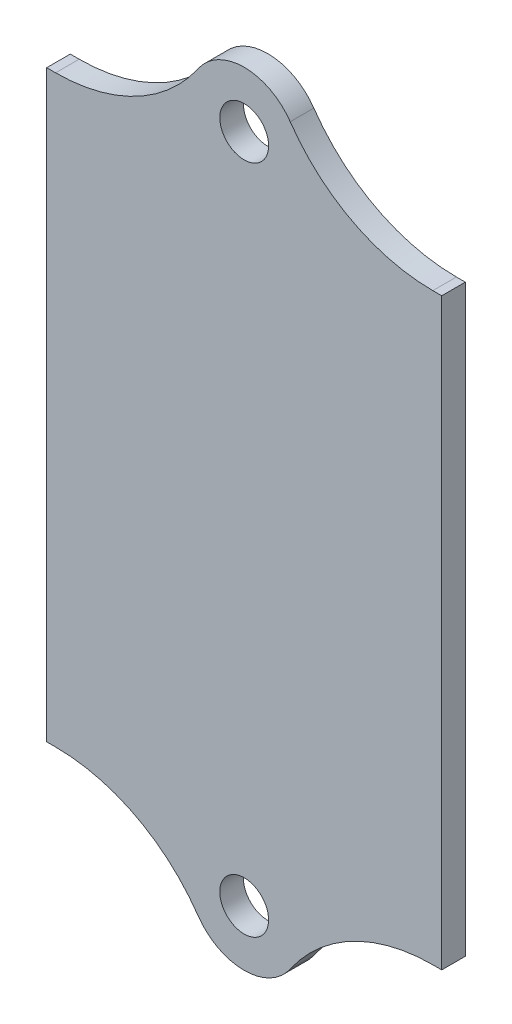
ISO-10303-21;
HEADER;
FILE_DESCRIPTION(('STEP AP214'),'2;1');
FILE_NAME('part.step','',(''),(''),'','','');
FILE_SCHEMA(('AUTOMOTIVE_DESIGN { 1 0 10303 214 1 1 1 1 }'));
ENDSEC;
DATA;
#1=APPLICATION_CONTEXT('core data for automotive mechanical design processes');
#2=APPLICATION_PROTOCOL_DEFINITION('international standard','automotive_design',2000,#1);
#3=PRODUCT_CONTEXT('',#1,'mechanical');
#4=PRODUCT('Part','Part','',(#3));
#5=PRODUCT_RELATED_PRODUCT_CATEGORY('part','',(#4));
#6=PRODUCT_DEFINITION_FORMATION('','',#4);
#7=PRODUCT_DEFINITION_CONTEXT('part definition',#1,'design');
#8=PRODUCT_DEFINITION('design','',#6,#7);
#9=PRODUCT_DEFINITION_SHAPE('','',#8);
#10=(LENGTH_UNIT() NAMED_UNIT(*) SI_UNIT(.MILLI.,.METRE.));
#11=(NAMED_UNIT(*) PLANE_ANGLE_UNIT() SI_UNIT($,.RADIAN.));
#12=(NAMED_UNIT(*) SI_UNIT($,.STERADIAN.) SOLID_ANGLE_UNIT());
#13=UNCERTAINTY_MEASURE_WITH_UNIT(LENGTH_MEASURE(1.E-05),#10,'distance_accuracy_value','');
#14=(GEOMETRIC_REPRESENTATION_CONTEXT(3) GLOBAL_UNCERTAINTY_ASSIGNED_CONTEXT((#13)) GLOBAL_UNIT_ASSIGNED_CONTEXT((#10,
#11,#12)) REPRESENTATION_CONTEXT('',''));
#15=CARTESIAN_POINT('',(0.,0.,0.));
#16=DIRECTION('',(0.,0.,1.));
#17=DIRECTION('',(1.,0.,0.));
#18=AXIS2_PLACEMENT_3D('',#15,#16,#17);
#19=CARTESIAN_POINT('',(-10.3513215814542,8.,1.5));
#20=DIRECTION('',(0.,1.,0.));
#21=DIRECTION('',(0.,0.,1.));
#22=AXIS2_PLACEMENT_3D('',#19,#20,#21);
#23=PLANE('',#22);
#24=DIRECTION('',(1.,0.,0.));
#25=VECTOR('',#24,1.);
#26=CARTESIAN_POINT('',(-10.3513215814542,8.,0.));
#27=LINE('',#26,#25);
#28=CARTESIAN_POINT('',(-10.3513215814542,8.,0.));
#29=VERTEX_POINT('',#28);
#30=CARTESIAN_POINT('',(-9.78631219471708,8.,0.));
#31=VERTEX_POINT('',#30);
#32=EDGE_CURVE('E155',#29,#31,#27,.T.);
#33=ORIENTED_EDGE('',*,*,#32,.T.);
#34=DIRECTION('',(0.,0.,-1.));
#35=VECTOR('',#34,1.);
#36=CARTESIAN_POINT('',(-9.78631219471708,8.,1.5));
#37=LINE('',#36,#35);
#38=CARTESIAN_POINT('',(-9.78631219471708,8.,1.5));
#39=VERTEX_POINT('',#38);
#40=EDGE_CURVE('E11',#39,#31,#37,.T.);
#41=ORIENTED_EDGE('',*,*,#40,.F.);
#42=DIRECTION('',(1.,0.,0.));
#43=VECTOR('',#42,1.);
#44=CARTESIAN_POINT('',(-10.3513215814542,8.,1.5));
#45=LINE('',#44,#43);
#46=CARTESIAN_POINT('',(-10.3513215814542,8.,1.5));
#47=VERTEX_POINT('',#46);
#48=EDGE_CURVE('E179',#47,#39,#45,.T.);
#49=ORIENTED_EDGE('',*,*,#48,.F.);
#50=DIRECTION('',(0.,0.,-1.));
#51=VECTOR('',#50,1.);
#52=CARTESIAN_POINT('',(-10.3513215814542,8.,1.5));
#53=LINE('',#52,#51);
#54=EDGE_CURVE('E151',#47,#29,#53,.T.);
#55=ORIENTED_EDGE('',*,*,#54,.T.);
#56=EDGE_LOOP('',(#33,#41,#49,#55));
#57=FACE_BOUND('',#56,.T.);
#58=ADVANCED_FACE('F35',(#57),#23,.F.);
#59=CARTESIAN_POINT('',(-9.78631219471708,-3.,1.5));
#60=DIRECTION('',(0.,0.,-1.));
#61=DIRECTION('',(-1.,0.,0.));
#62=AXIS2_PLACEMENT_3D('',#59,#60,#61);
#63=CYLINDRICAL_SURFACE('',#62,11.);
#64=CARTESIAN_POINT('',(-9.78631219471708,-3.,0.));
#65=DIRECTION('',(0.,0.,-1.));
#66=DIRECTION('',(1.,0.,0.));
#67=AXIS2_PLACEMENT_3D('',#64,#65,#66);
#68=CIRCLE('',#67,11.);
#69=CARTESIAN_POINT('',(-0.725494548951314,3.23711340206186,0.));
#70=VERTEX_POINT('',#69);
#71=EDGE_CURVE('E158',#31,#70,#68,.T.);
#72=ORIENTED_EDGE('',*,*,#71,.T.);
#73=DIRECTION('',(0.,0.,-1.));
#74=VECTOR('',#73,1.);
#75=CARTESIAN_POINT('',(-0.725494548951314,3.23711340206186,1.5));
#76=LINE('',#75,#74);
#77=CARTESIAN_POINT('',(-0.725494548951314,3.23711340206186,1.5));
#78=VERTEX_POINT('',#77);
#79=EDGE_CURVE('E43',#78,#70,#76,.T.);
#80=ORIENTED_EDGE('',*,*,#79,.F.);
#81=CARTESIAN_POINT('',(-9.78631219471708,-3.,1.5));
#82=DIRECTION('',(0.,0.,-1.));
#83=DIRECTION('',(1.,0.,0.));
#84=AXIS2_PLACEMENT_3D('',#81,#82,#83);
#85=CIRCLE('',#84,11.);
#86=EDGE_CURVE('E105',#39,#78,#85,.T.);
#87=ORIENTED_EDGE('',*,*,#86,.F.);
#88=ORIENTED_EDGE('',*,*,#40,.T.);
#89=EDGE_LOOP('',(#72,#80,#87,#88));
#90=FACE_BOUND('',#89,.T.);
#91=ADVANCED_FACE('F258',(#90),#63,.F.);
#92=CARTESIAN_POINT('',(2.19867841854582,5.25,1.5));
#93=DIRECTION('',(0.,0.,-1.));
#94=DIRECTION('',(-1.,0.,0.));
#95=AXIS2_PLACEMENT_3D('',#92,#93,#94);
#96=CYLINDRICAL_SURFACE('',#95,3.55);
#97=CARTESIAN_POINT('',(2.19867841854582,5.25,0.));
#98=DIRECTION('',(0.,0.,1.));
#99=DIRECTION('',(1.,0.,0.));
#100=AXIS2_PLACEMENT_3D('',#97,#98,#99);
#101=CIRCLE('',#100,3.55);
#102=CARTESIAN_POINT('',(5.12285138604296,3.23711340206186,0.));
#103=VERTEX_POINT('',#102);
#104=EDGE_CURVE('E161',#70,#103,#101,.T.);
#105=ORIENTED_EDGE('',*,*,#104,.T.);
#106=DIRECTION('',(0.,0.,-1.));
#107=VECTOR('',#106,1.);
#108=CARTESIAN_POINT('',(5.12285138604296,3.23711340206186,1.5));
#109=LINE('',#108,#107);
#110=CARTESIAN_POINT('',(5.12285138604296,3.23711340206186,1.5));
#111=VERTEX_POINT('',#110);
#112=EDGE_CURVE('E198',#111,#103,#109,.T.);
#113=ORIENTED_EDGE('',*,*,#112,.F.);
#114=CARTESIAN_POINT('',(2.19867841854582,5.25,1.5));
#115=DIRECTION('',(0.,0.,1.));
#116=DIRECTION('',(1.,0.,0.));
#117=AXIS2_PLACEMENT_3D('',#114,#115,#116);
#118=CIRCLE('',#117,3.55);
#119=EDGE_CURVE('E206',#78,#111,#118,.T.);
#120=ORIENTED_EDGE('',*,*,#119,.F.);
#121=ORIENTED_EDGE('',*,*,#79,.T.);
#122=EDGE_LOOP('',(#105,#113,#120,#121));
#123=FACE_BOUND('',#122,.T.);
#124=ADVANCED_FACE('F204',(#123),#96,.T.);
#125=CARTESIAN_POINT('',(14.1836690318087,-3.,1.5));
#126=DIRECTION('',(0.,0.,-1.));
#127=DIRECTION('',(-1.,0.,0.));
#128=AXIS2_PLACEMENT_3D('',#125,#126,#127);
#129=CYLINDRICAL_SURFACE('',#128,11.);
#130=CARTESIAN_POINT('',(14.1836690318087,-3.,0.));
#131=DIRECTION('',(0.,0.,-1.));
#132=DIRECTION('',(1.,0.,0.));
#133=AXIS2_PLACEMENT_3D('',#130,#131,#132);
#134=CIRCLE('',#133,11.);
#135=CARTESIAN_POINT('',(14.1836690318087,8.,0.));
#136=VERTEX_POINT('',#135);
#137=EDGE_CURVE('E163',#103,#136,#134,.T.);
#138=ORIENTED_EDGE('',*,*,#137,.T.);
#139=DIRECTION('',(0.,0.,-1.));
#140=VECTOR('',#139,1.);
#141=CARTESIAN_POINT('',(14.1836690318087,8.,1.5));
#142=LINE('',#141,#140);
#143=CARTESIAN_POINT('',(14.1836690318087,8.,1.5));
#144=VERTEX_POINT('',#143);
#145=EDGE_CURVE('E195',#144,#136,#142,.T.);
#146=ORIENTED_EDGE('',*,*,#145,.F.);
#147=CARTESIAN_POINT('',(14.1836690318087,-3.,1.5));
#148=DIRECTION('',(0.,0.,-1.));
#149=DIRECTION('',(1.,0.,0.));
#150=AXIS2_PLACEMENT_3D('',#147,#148,#149);
#151=CIRCLE('',#150,11.);
#152=EDGE_CURVE('E224',#111,#144,#151,.T.);
#153=ORIENTED_EDGE('',*,*,#152,.F.);
#154=ORIENTED_EDGE('',*,*,#112,.T.);
#155=EDGE_LOOP('',(#138,#146,#153,#154));
#156=FACE_BOUND('',#155,.T.);
#157=ADVANCED_FACE('F215',(#156),#129,.F.);
#158=CARTESIAN_POINT('',(14.1836690318087,8.,1.5));
#159=DIRECTION('',(0.,1.,0.));
#160=DIRECTION('',(-1.,0.,0.));
#161=AXIS2_PLACEMENT_3D('',#158,#159,#160);
#162=PLANE('',#161);
#163=DIRECTION('',(1.,0.,0.));
#164=VECTOR('',#163,1.);
#165=CARTESIAN_POINT('',(14.1836690318087,8.,0.));
#166=LINE('',#165,#164);
#167=CARTESIAN_POINT('',(14.7486784185458,8.,0.));
#168=VERTEX_POINT('',#167);
#169=EDGE_CURVE('E165',#136,#168,#166,.T.);
#170=ORIENTED_EDGE('',*,*,#169,.T.);
#171=DIRECTION('',(0.,0.,-1.));
#172=VECTOR('',#171,1.);
#173=CARTESIAN_POINT('',(14.7486784185458,8.,1.5));
#174=LINE('',#173,#172);
#175=CARTESIAN_POINT('',(14.7486784185458,8.,1.5));
#176=VERTEX_POINT('',#175);
#177=EDGE_CURVE('E192',#176,#168,#174,.T.);
#178=ORIENTED_EDGE('',*,*,#177,.F.);
#179=DIRECTION('',(1.,0.,0.));
#180=VECTOR('',#179,1.);
#181=CARTESIAN_POINT('',(14.1836690318087,8.,1.5));
#182=LINE('',#181,#180);
#183=EDGE_CURVE('E221',#144,#176,#182,.T.);
#184=ORIENTED_EDGE('',*,*,#183,.F.);
#185=ORIENTED_EDGE('',*,*,#145,.T.);
#186=EDGE_LOOP('',(#170,#178,#184,#185));
#187=FACE_BOUND('',#186,.T.);
#188=ADVANCED_FACE('F219',(#187),#162,.F.);
#189=CARTESIAN_POINT('',(14.7486784185458,8.,1.5));
#190=DIRECTION('',(-1.,0.,0.));
#191=DIRECTION('',(0.,-1.,0.));
#192=AXIS2_PLACEMENT_3D('',#189,#190,#191);
#193=PLANE('',#192);
#194=DIRECTION('',(0.,1.,0.));
#195=VECTOR('',#194,1.);
#196=CARTESIAN_POINT('',(14.7486784185458,8.,0.));
#197=LINE('',#196,#195);
#198=CARTESIAN_POINT('',(14.7486784185458,45.1,0.));
#199=VERTEX_POINT('',#198);
#200=EDGE_CURVE('E167',#168,#199,#197,.T.);
#201=ORIENTED_EDGE('',*,*,#200,.T.);
#202=DIRECTION('',(0.,0.,-1.));
#203=VECTOR('',#202,1.);
#204=CARTESIAN_POINT('',(14.7486784185458,45.1,1.5));
#205=LINE('',#204,#203);
#206=CARTESIAN_POINT('',(14.7486784185458,45.1,1.5));
#207=VERTEX_POINT('',#206);
#208=EDGE_CURVE('E189',#207,#199,#205,.T.);
#209=ORIENTED_EDGE('',*,*,#208,.F.);
#210=DIRECTION('',(0.,1.,0.));
#211=VECTOR('',#210,1.);
#212=CARTESIAN_POINT('',(14.7486784185458,8.,1.5));
#213=LINE('',#212,#211);
#214=EDGE_CURVE('E223',#176,#207,#213,.T.);
#215=ORIENTED_EDGE('',*,*,#214,.F.);
#216=ORIENTED_EDGE('',*,*,#177,.T.);
#217=EDGE_LOOP('',(#201,#209,#215,#216));
#218=FACE_BOUND('',#217,.T.);
#219=ADVANCED_FACE('F271',(#218),#193,.F.);
#220=CARTESIAN_POINT('',(14.3230340715279,45.1,1.5));
#221=DIRECTION('',(0.,-1.,0.));
#222=DIRECTION('',(0.,0.,-1.));
#223=AXIS2_PLACEMENT_3D('',#220,#221,#222);
#224=PLANE('',#223);
#225=DIRECTION('',(-1.,0.,0.));
#226=VECTOR('',#225,1.);
#227=CARTESIAN_POINT('',(14.3230340715279,45.1,0.));
#228=LINE('',#227,#226);
#229=CARTESIAN_POINT('',(14.1836690318087,45.1,0.));
#230=VERTEX_POINT('',#229);
#231=EDGE_CURVE('E170',#199,#230,#228,.T.);
#232=ORIENTED_EDGE('',*,*,#231,.T.);
#233=DIRECTION('',(0.,0.,-1.));
#234=VECTOR('',#233,1.);
#235=CARTESIAN_POINT('',(14.1836690318087,45.1,1.5));
#236=LINE('',#235,#234);
#237=CARTESIAN_POINT('',(14.1836690318087,45.1,1.5));
#238=VERTEX_POINT('',#237);
#239=EDGE_CURVE('E186',#238,#230,#236,.T.);
#240=ORIENTED_EDGE('',*,*,#239,.F.);
#241=DIRECTION('',(-1.,0.,0.));
#242=VECTOR('',#241,1.);
#243=CARTESIAN_POINT('',(14.7486784185458,45.1,1.5));
#244=LINE('',#243,#242);
#245=EDGE_CURVE('E226',#207,#238,#244,.T.);
#246=ORIENTED_EDGE('',*,*,#245,.F.);
#247=ORIENTED_EDGE('',*,*,#208,.T.);
#248=EDGE_LOOP('',(#232,#240,#246,#247));
#249=FACE_BOUND('',#248,.T.);
#250=ADVANCED_FACE('F274',(#249),#224,.F.);
#251=CARTESIAN_POINT('',(14.1836690318087,56.1,1.5));
#252=DIRECTION('',(0.,0.,-1.));
#253=DIRECTION('',(-1.,0.,0.));
#254=AXIS2_PLACEMENT_3D('',#251,#252,#253);
#255=CYLINDRICAL_SURFACE('',#254,11.);
#256=CARTESIAN_POINT('',(14.1836690318087,56.1,0.));
#257=DIRECTION('',(0.,0.,-1.));
#258=DIRECTION('',(1.,0.,0.));
#259=AXIS2_PLACEMENT_3D('',#256,#257,#258);
#260=CIRCLE('',#259,11.);
#261=CARTESIAN_POINT('',(5.12285138604295,49.8628865979382,0.));
#262=VERTEX_POINT('',#261);
#263=EDGE_CURVE('E172',#230,#262,#260,.T.);
#264=ORIENTED_EDGE('',*,*,#263,.T.);
#265=DIRECTION('',(0.,0.,-1.));
#266=VECTOR('',#265,1.);
#267=CARTESIAN_POINT('',(5.12285138604295,49.8628865979382,1.5));
#268=LINE('',#267,#266);
#269=CARTESIAN_POINT('',(5.12285138604295,49.8628865979382,1.5));
#270=VERTEX_POINT('',#269);
#271=EDGE_CURVE('E183',#270,#262,#268,.T.);
#272=ORIENTED_EDGE('',*,*,#271,.F.);
#273=CARTESIAN_POINT('',(14.1836690318087,56.1,1.5));
#274=DIRECTION('',(0.,0.,-1.));
#275=DIRECTION('',(1.,0.,0.));
#276=AXIS2_PLACEMENT_3D('',#273,#274,#275);
#277=CIRCLE('',#276,11.);
#278=EDGE_CURVE('E232',#238,#270,#277,.T.);
#279=ORIENTED_EDGE('',*,*,#278,.F.);
#280=ORIENTED_EDGE('',*,*,#239,.T.);
#281=EDGE_LOOP('',(#264,#272,#279,#280));
#282=FACE_BOUND('',#281,.T.);
#283=ADVANCED_FACE('F238',(#282),#255,.F.);
#284=CARTESIAN_POINT('',(2.19867841854582,47.85,1.5));
#285=DIRECTION('',(0.,0.,-1.));
#286=DIRECTION('',(-1.,0.,0.));
#287=AXIS2_PLACEMENT_3D('',#284,#285,#286);
#288=CYLINDRICAL_SURFACE('',#287,3.55);
#289=CARTESIAN_POINT('',(2.19867841854582,47.85,0.));
#290=DIRECTION('',(0.,0.,1.));
#291=DIRECTION('',(1.,0.,0.));
#292=AXIS2_PLACEMENT_3D('',#289,#290,#291);
#293=CIRCLE('',#292,3.55);
#294=CARTESIAN_POINT('',(-0.725494548951327,49.8628865979381,0.));
#295=VERTEX_POINT('',#294);
#296=EDGE_CURVE('E174',#262,#295,#293,.T.);
#297=ORIENTED_EDGE('',*,*,#296,.T.);
#298=DIRECTION('',(0.,0.,-1.));
#299=VECTOR('',#298,1.);
#300=CARTESIAN_POINT('',(-0.725494548951327,49.8628865979381,1.5));
#301=LINE('',#300,#299);
#302=CARTESIAN_POINT('',(-0.725494548951327,49.8628865979381,1.5));
#303=VERTEX_POINT('',#302);
#304=EDGE_CURVE('E146',#303,#295,#301,.T.);
#305=ORIENTED_EDGE('',*,*,#304,.F.);
#306=CARTESIAN_POINT('',(2.19867841854582,47.85,1.5));
#307=DIRECTION('',(0.,0.,1.));
#308=DIRECTION('',(1.,0.,0.));
#309=AXIS2_PLACEMENT_3D('',#306,#307,#308);
#310=CIRCLE('',#309,3.55);
#311=EDGE_CURVE('E136',#270,#303,#310,.T.);
#312=ORIENTED_EDGE('',*,*,#311,.F.);
#313=ORIENTED_EDGE('',*,*,#271,.T.);
#314=EDGE_LOOP('',(#297,#305,#312,#313));
#315=FACE_BOUND('',#314,.T.);
#316=ADVANCED_FACE('F242',(#315),#288,.T.);
#317=CARTESIAN_POINT('',(-9.78631219471709,56.1,1.5));
#318=DIRECTION('',(0.,0.,-1.));
#319=DIRECTION('',(-1.,0.,0.));
#320=AXIS2_PLACEMENT_3D('',#317,#318,#319);
#321=CYLINDRICAL_SURFACE('',#320,11.);
#322=CARTESIAN_POINT('',(-9.78631219471709,56.1,0.));
#323=DIRECTION('',(0.,0.,-1.));
#324=DIRECTION('',(1.,0.,0.));
#325=AXIS2_PLACEMENT_3D('',#322,#323,#324);
#326=CIRCLE('',#325,11.);
#327=CARTESIAN_POINT('',(-9.78631219471709,45.1,0.));
#328=VERTEX_POINT('',#327);
#329=EDGE_CURVE('E145',#295,#328,#326,.T.);
#330=ORIENTED_EDGE('',*,*,#329,.T.);
#331=DIRECTION('',(0.,0.,-1.));
#332=VECTOR('',#331,1.);
#333=CARTESIAN_POINT('',(-9.78631219471709,45.1,1.5));
#334=LINE('',#333,#332);
#335=CARTESIAN_POINT('',(-9.78631219471709,45.1,1.5));
#336=VERTEX_POINT('',#335);
#337=EDGE_CURVE('E142',#336,#328,#334,.T.);
#338=ORIENTED_EDGE('',*,*,#337,.F.);
#339=CARTESIAN_POINT('',(-9.78631219471709,56.1,1.5));
#340=DIRECTION('',(0.,0.,-1.));
#341=DIRECTION('',(1.,0.,0.));
#342=AXIS2_PLACEMENT_3D('',#339,#340,#341);
#343=CIRCLE('',#342,11.);
#344=EDGE_CURVE('E130',#303,#336,#343,.T.);
#345=ORIENTED_EDGE('',*,*,#344,.F.);
#346=ORIENTED_EDGE('',*,*,#304,.T.);
#347=EDGE_LOOP('',(#330,#338,#345,#346));
#348=FACE_BOUND('',#347,.T.);
#349=ADVANCED_FACE('F143',(#348),#321,.F.);
#350=CARTESIAN_POINT('',(-9.92567723443631,45.1,1.5));
#351=DIRECTION('',(0.,-1.,0.));
#352=DIRECTION('',(0.,0.,-1.));
#353=AXIS2_PLACEMENT_3D('',#350,#351,#352);
#354=PLANE('',#353);
#355=DIRECTION('',(-1.,0.,0.));
#356=VECTOR('',#355,1.);
#357=CARTESIAN_POINT('',(-9.92567723443631,45.1,0.));
#358=LINE('',#357,#356);
#359=CARTESIAN_POINT('',(-10.3513215814542,45.1,0.));
#360=VERTEX_POINT('',#359);
#361=EDGE_CURVE('E91',#328,#360,#358,.T.);
#362=ORIENTED_EDGE('',*,*,#361,.T.);
#363=DIRECTION('',(0.,0.,-1.));
#364=VECTOR('',#363,1.);
#365=CARTESIAN_POINT('',(-10.3513215814542,45.1,1.5));
#366=LINE('',#365,#364);
#367=CARTESIAN_POINT('',(-10.3513215814542,45.1,1.5));
#368=VERTEX_POINT('',#367);
#369=EDGE_CURVE('E147',#368,#360,#366,.T.);
#370=ORIENTED_EDGE('',*,*,#369,.F.);
#371=DIRECTION('',(-1.,0.,0.));
#372=VECTOR('',#371,1.);
#373=CARTESIAN_POINT('',(-9.78631219471709,45.1,1.5));
#374=LINE('',#373,#372);
#375=EDGE_CURVE('E134',#336,#368,#374,.T.);
#376=ORIENTED_EDGE('',*,*,#375,.F.);
#377=ORIENTED_EDGE('',*,*,#337,.T.);
#378=EDGE_LOOP('',(#362,#370,#376,#377));
#379=FACE_BOUND('',#378,.T.);
#380=ADVANCED_FACE('F149',(#379),#354,.F.);
#381=CARTESIAN_POINT('',(-10.3513215814542,8.,1.5));
#382=DIRECTION('',(1.,0.,0.));
#383=DIRECTION('',(0.,1.,0.));
#384=AXIS2_PLACEMENT_3D('',#381,#382,#383);
#385=PLANE('',#384);
#386=DIRECTION('',(0.,-1.,0.));
#387=VECTOR('',#386,1.);
#388=CARTESIAN_POINT('',(-10.3513215814542,8.,0.));
#389=LINE('',#388,#387);
#390=EDGE_CURVE('E97',#360,#29,#389,.T.);
#391=ORIENTED_EDGE('',*,*,#390,.T.);
#392=ORIENTED_EDGE('',*,*,#54,.F.);
#393=DIRECTION('',(0.,-1.,0.));
#394=VECTOR('',#393,1.);
#395=CARTESIAN_POINT('',(-10.3513215814542,8.,1.5));
#396=LINE('',#395,#394);
#397=EDGE_CURVE('E51',#368,#47,#396,.T.);
#398=ORIENTED_EDGE('',*,*,#397,.F.);
#399=ORIENTED_EDGE('',*,*,#369,.T.);
#400=EDGE_LOOP('',(#391,#392,#398,#399));
#401=FACE_BOUND('',#400,.T.);
#402=ADVANCED_FACE('F246',(#401),#385,.F.);
#403=CARTESIAN_POINT('',(-9.78631219471708,-3.,1.5));
#404=DIRECTION('',(0.,0.,1.));
#405=DIRECTION('',(1.,0.,0.));
#406=AXIS2_PLACEMENT_3D('',#403,#404,#405);
#407=PLANE('',#406);
#408=CARTESIAN_POINT('',(2.19867841854582,47.85,1.5));
#409=DIRECTION('',(0.,0.,1.));
#410=DIRECTION('',(1.,0.,0.));
#411=AXIS2_PLACEMENT_3D('',#408,#409,#410);
#412=CIRCLE('',#411,1.55);
#413=CARTESIAN_POINT('',(3.74867841854582,47.85,1.5));
#414=VERTEX_POINT('',#413);
#415=EDGE_CURVE('E340',#414,#414,#412,.T.);
#416=ORIENTED_EDGE('',*,*,#415,.F.);
#417=EDGE_LOOP('',(#416));
#418=FACE_BOUND('',#417,.T.);
#419=CARTESIAN_POINT('',(2.19867841854582,5.25,1.5));
#420=DIRECTION('',(0.,0.,1.));
#421=DIRECTION('',(1.,0.,0.));
#422=AXIS2_PLACEMENT_3D('',#419,#420,#421);
#423=CIRCLE('',#422,1.55);
#424=CARTESIAN_POINT('',(3.74867841854582,5.25,1.5));
#425=VERTEX_POINT('',#424);
#426=EDGE_CURVE('E345',#425,#425,#423,.T.);
#427=ORIENTED_EDGE('',*,*,#426,.F.);
#428=EDGE_LOOP('',(#427));
#429=FACE_BOUND('',#428,.T.);
#430=ORIENTED_EDGE('',*,*,#48,.T.);
#431=ORIENTED_EDGE('',*,*,#86,.T.);
#432=ORIENTED_EDGE('',*,*,#119,.T.);
#433=ORIENTED_EDGE('',*,*,#152,.T.);
#434=ORIENTED_EDGE('',*,*,#183,.T.);
#435=ORIENTED_EDGE('',*,*,#214,.T.);
#436=ORIENTED_EDGE('',*,*,#245,.T.);
#437=ORIENTED_EDGE('',*,*,#278,.T.);
#438=ORIENTED_EDGE('',*,*,#311,.T.);
#439=ORIENTED_EDGE('',*,*,#344,.T.);
#440=ORIENTED_EDGE('',*,*,#375,.T.);
#441=ORIENTED_EDGE('',*,*,#397,.T.);
#442=EDGE_LOOP('',(#430,#431,#432,#433,#434,#435,#436,#437,#438,#439,#440,#441));
#443=FACE_BOUND('',#442,.T.);
#444=ADVANCED_FACE('F132',(#418,#429,#443),#407,.T.);
#445=CARTESIAN_POINT('',(-9.78631219471708,-3.,0.));
#446=DIRECTION('',(0.,0.,1.));
#447=DIRECTION('',(1.,0.,0.));
#448=AXIS2_PLACEMENT_3D('',#445,#446,#447);
#449=PLANE('',#448);
#450=CARTESIAN_POINT('',(2.19867841854582,47.85,0.));
#451=DIRECTION('',(0.,0.,1.));
#452=DIRECTION('',(1.,0.,0.));
#453=AXIS2_PLACEMENT_3D('',#450,#451,#452);
#454=CIRCLE('',#453,1.55);
#455=CARTESIAN_POINT('',(3.74867841854582,47.85,0.));
#456=VERTEX_POINT('',#455);
#457=EDGE_CURVE('E159',#456,#456,#454,.T.);
#458=ORIENTED_EDGE('',*,*,#457,.T.);
#459=EDGE_LOOP('',(#458));
#460=FACE_BOUND('',#459,.T.);
#461=CARTESIAN_POINT('',(2.19867841854582,5.25,0.));
#462=DIRECTION('',(0.,0.,1.));
#463=DIRECTION('',(1.,0.,0.));
#464=AXIS2_PLACEMENT_3D('',#461,#462,#463);
#465=CIRCLE('',#464,1.55);
#466=CARTESIAN_POINT('',(3.74867841854582,5.25,0.));
#467=VERTEX_POINT('',#466);
#468=EDGE_CURVE('E341',#467,#467,#465,.T.);
#469=ORIENTED_EDGE('',*,*,#468,.T.);
#470=EDGE_LOOP('',(#469));
#471=FACE_BOUND('',#470,.T.);
#472=ORIENTED_EDGE('',*,*,#32,.F.);
#473=ORIENTED_EDGE('',*,*,#390,.F.);
#474=ORIENTED_EDGE('',*,*,#361,.F.);
#475=ORIENTED_EDGE('',*,*,#329,.F.);
#476=ORIENTED_EDGE('',*,*,#296,.F.);
#477=ORIENTED_EDGE('',*,*,#263,.F.);
#478=ORIENTED_EDGE('',*,*,#231,.F.);
#479=ORIENTED_EDGE('',*,*,#200,.F.);
#480=ORIENTED_EDGE('',*,*,#169,.F.);
#481=ORIENTED_EDGE('',*,*,#137,.F.);
#482=ORIENTED_EDGE('',*,*,#104,.F.);
#483=ORIENTED_EDGE('',*,*,#71,.F.);
#484=EDGE_LOOP('',(#472,#473,#474,#475,#476,#477,#478,#479,#480,#481,#482,#483));
#485=FACE_BOUND('',#484,.T.);
#486=ADVANCED_FACE('F210',(#460,#471,#485),#449,.F.);
#487=CARTESIAN_POINT('',(2.19867841854582,5.25,0.));
#488=DIRECTION('',(0.,0.,1.));
#489=DIRECTION('',(1.,0.,0.));
#490=AXIS2_PLACEMENT_3D('',#487,#488,#489);
#491=CYLINDRICAL_SURFACE('',#490,1.55);
#492=ORIENTED_EDGE('',*,*,#468,.F.);
#493=EDGE_LOOP('',(#492));
#494=FACE_BOUND('',#493,.T.);
#495=ORIENTED_EDGE('',*,*,#426,.T.);
#496=EDGE_LOOP('',(#495));
#497=FACE_BOUND('',#496,.T.);
#498=ADVANCED_FACE('F312',(#494,#497),#491,.F.);
#499=CARTESIAN_POINT('',(2.19867841854582,47.85,0.));
#500=DIRECTION('',(0.,0.,1.));
#501=DIRECTION('',(1.,0.,0.));
#502=AXIS2_PLACEMENT_3D('',#499,#500,#501);
#503=CYLINDRICAL_SURFACE('',#502,1.55);
#504=ORIENTED_EDGE('',*,*,#457,.F.);
#505=EDGE_LOOP('',(#504));
#506=FACE_BOUND('',#505,.T.);
#507=ORIENTED_EDGE('',*,*,#415,.T.);
#508=EDGE_LOOP('',(#507));
#509=FACE_BOUND('',#508,.T.);
#510=ADVANCED_FACE('F321',(#506,#509),#503,.F.);
#511=CLOSED_SHELL('',(#58,#91,#124,#157,#188,#219,#250,#283,#316,#349,#380,#402,#444,#486,#498,#510));
#512=MANIFOLD_SOLID_BREP('B2',#511);
#513=ADVANCED_BREP_SHAPE_REPRESENTATION('',(#18,#512),#14);
#514=SHAPE_DEFINITION_REPRESENTATION(#9,#513);
ENDSEC;
END-ISO-10303-21;
